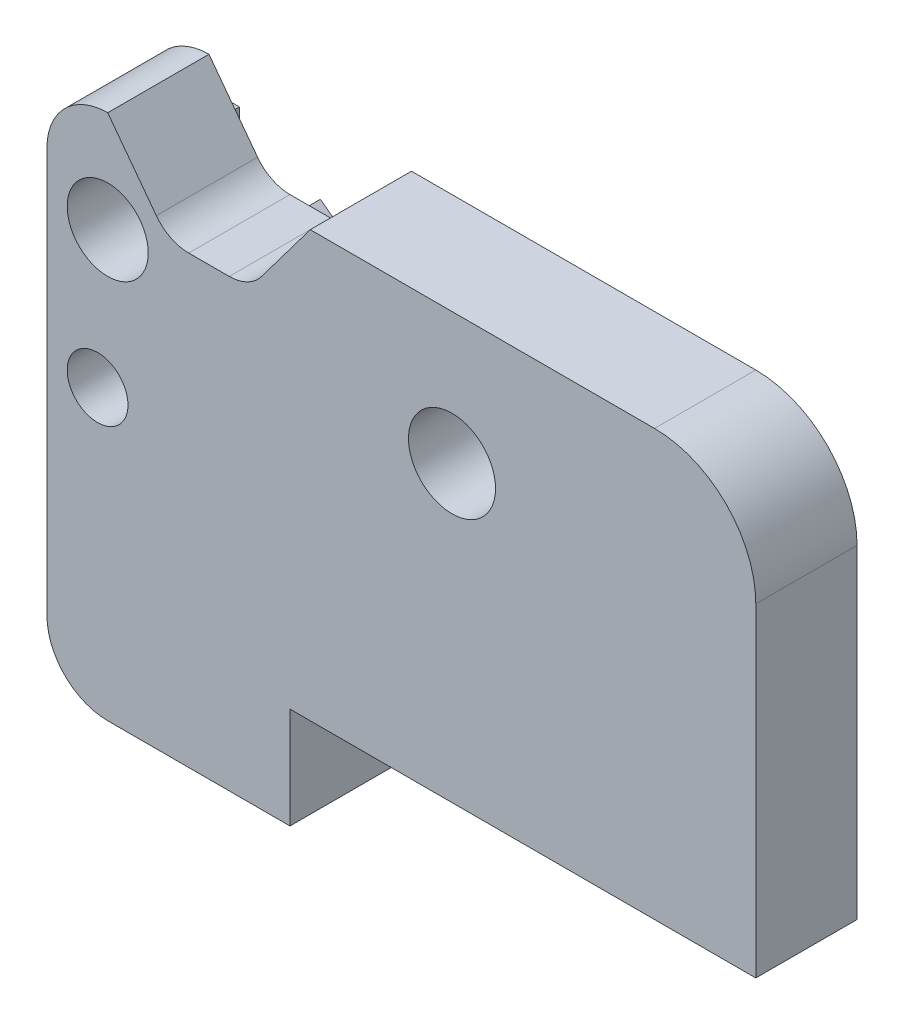
ISO-10303-21;
HEADER;
FILE_DESCRIPTION(('STEP AP214'),'2;1');
FILE_NAME('part.step','',(''),(''),'','','');
FILE_SCHEMA(('AUTOMOTIVE_DESIGN { 1 0 10303 214 1 1 1 1 }'));
ENDSEC;
DATA;
#1=APPLICATION_CONTEXT('core data for automotive mechanical design processes');
#2=APPLICATION_PROTOCOL_DEFINITION('international standard','automotive_design',2000,#1);
#3=PRODUCT_CONTEXT('',#1,'mechanical');
#4=PRODUCT('Part','Part','',(#3));
#5=PRODUCT_RELATED_PRODUCT_CATEGORY('part','',(#4));
#6=PRODUCT_DEFINITION_FORMATION('','',#4);
#7=PRODUCT_DEFINITION_CONTEXT('part definition',#1,'design');
#8=PRODUCT_DEFINITION('design','',#6,#7);
#9=PRODUCT_DEFINITION_SHAPE('','',#8);
#10=(LENGTH_UNIT() NAMED_UNIT(*) SI_UNIT(.MILLI.,.METRE.));
#11=(NAMED_UNIT(*) PLANE_ANGLE_UNIT() SI_UNIT($,.RADIAN.));
#12=(NAMED_UNIT(*) SI_UNIT($,.STERADIAN.) SOLID_ANGLE_UNIT());
#13=UNCERTAINTY_MEASURE_WITH_UNIT(LENGTH_MEASURE(1.E-05),#10,'distance_accuracy_value','');
#14=(GEOMETRIC_REPRESENTATION_CONTEXT(3) GLOBAL_UNCERTAINTY_ASSIGNED_CONTEXT((#13)) GLOBAL_UNIT_ASSIGNED_CONTEXT((#10,
#11,#12)) REPRESENTATION_CONTEXT('',''));
#15=CARTESIAN_POINT('',(0.,0.,0.));
#16=DIRECTION('',(0.,0.,1.));
#17=DIRECTION('',(1.,0.,0.));
#18=AXIS2_PLACEMENT_3D('',#15,#16,#17);
#19=CARTESIAN_POINT('',(-8.,6.5,0.));
#20=DIRECTION('',(0.,0.,1.));
#21=DIRECTION('',(1.,0.,0.));
#22=AXIS2_PLACEMENT_3D('',#19,#20,#21);
#23=PLANE('',#22);
#24=CARTESIAN_POINT('',(-17.,3.5,0.));
#25=DIRECTION('',(0.,0.,1.));
#26=DIRECTION('',(1.,0.,0.));
#27=AXIS2_PLACEMENT_3D('',#24,#25,#26);
#28=CIRCLE('',#27,3.);
#29=CARTESIAN_POINT('',(-20.,3.5,0.));
#30=VERTEX_POINT('',#29);
#31=CARTESIAN_POINT('',(-17.,6.5,0.));
#32=VERTEX_POINT('',#31);
#33=EDGE_CURVE('E397',#30,#32,#28,.F.);
#34=ORIENTED_EDGE('',*,*,#33,.T.);
#35=DIRECTION('',(-0.6,0.8,0.));
#36=VECTOR('',#35,1.);
#37=CARTESIAN_POINT('',(-14.,2.5,0.));
#38=LINE('',#37,#36);
#39=CARTESIAN_POINT('',(-14.6,3.3,0.));
#40=VERTEX_POINT('',#39);
#41=EDGE_CURVE('E211',#40,#32,#38,.T.);
#42=ORIENTED_EDGE('',*,*,#41,.F.);
#43=CARTESIAN_POINT('',(-13.,4.5,0.));
#44=DIRECTION('',(0.,0.,1.));
#45=DIRECTION('',(1.,0.,0.));
#46=AXIS2_PLACEMENT_3D('',#43,#44,#45);
#47=CIRCLE('',#46,2.);
#48=CARTESIAN_POINT('',(-13.,2.5,0.));
#49=VERTEX_POINT('',#48);
#50=EDGE_CURVE('E11',#40,#49,#47,.T.);
#51=ORIENTED_EDGE('',*,*,#50,.T.);
#52=DIRECTION('',(-1.,0.,0.));
#53=VECTOR('',#52,1.);
#54=CARTESIAN_POINT('',(-14.,2.5,0.));
#55=LINE('',#54,#53);
#56=CARTESIAN_POINT('',(-11.,2.5,0.));
#57=VERTEX_POINT('',#56);
#58=EDGE_CURVE('E747',#57,#49,#55,.T.);
#59=ORIENTED_EDGE('',*,*,#58,.F.);
#60=CARTESIAN_POINT('',(-11.,4.5,0.));
#61=DIRECTION('',(0.,0.,1.));
#62=DIRECTION('',(1.,0.,0.));
#63=AXIS2_PLACEMENT_3D('',#60,#61,#62);
#64=CIRCLE('',#63,2.);
#65=CARTESIAN_POINT('',(-9.40000000000001,3.3,0.));
#66=VERTEX_POINT('',#65);
#67=EDGE_CURVE('E355',#57,#66,#64,.T.);
#68=ORIENTED_EDGE('',*,*,#67,.T.);
#69=DIRECTION('',(-0.600000000000001,-0.799999999999999,0.));
#70=VECTOR('',#69,1.);
#71=CARTESIAN_POINT('',(-10.,2.5,0.));
#72=LINE('',#71,#70);
#73=CARTESIAN_POINT('',(-7.,6.5,0.));
#74=VERTEX_POINT('',#73);
#75=EDGE_CURVE('E373',#74,#66,#72,.T.);
#76=ORIENTED_EDGE('',*,*,#75,.F.);
#77=DIRECTION('',(-1.,0.,0.));
#78=VECTOR('',#77,1.);
#79=CARTESIAN_POINT('',(15.,6.5,0.));
#80=LINE('',#79,#78);
#81=CARTESIAN_POINT('',(10.,6.5,0.));
#82=VERTEX_POINT('',#81);
#83=EDGE_CURVE('E210',#82,#74,#80,.T.);
#84=ORIENTED_EDGE('',*,*,#83,.F.);
#85=CARTESIAN_POINT('',(10.,1.5,0.));
#86=DIRECTION('',(0.,0.,1.));
#87=DIRECTION('',(1.,0.,0.));
#88=AXIS2_PLACEMENT_3D('',#85,#86,#87);
#89=CIRCLE('',#88,5.);
#90=CARTESIAN_POINT('',(15.,1.49999999999999,0.));
#91=VERTEX_POINT('',#90);
#92=EDGE_CURVE('E746',#82,#91,#89,.F.);
#93=ORIENTED_EDGE('',*,*,#92,.T.);
#94=DIRECTION('',(0.,1.,0.));
#95=VECTOR('',#94,1.);
#96=CARTESIAN_POINT('',(15.,-14.5,0.));
#97=LINE('',#96,#95);
#98=CARTESIAN_POINT('',(15.,-14.5,0.));
#99=VERTEX_POINT('',#98);
#100=EDGE_CURVE('E219',#99,#91,#97,.T.);
#101=ORIENTED_EDGE('',*,*,#100,.F.);
#102=DIRECTION('',(1.,0.,0.));
#103=VECTOR('',#102,1.);
#104=CARTESIAN_POINT('',(-8.,-14.5,0.));
#105=LINE('',#104,#103);
#106=CARTESIAN_POINT('',(-2.00000000000001,-14.5,0.));
#107=VERTEX_POINT('',#106);
#108=EDGE_CURVE('E224',#107,#99,#105,.T.);
#109=ORIENTED_EDGE('',*,*,#108,.F.);
#110=DIRECTION('',(0.,-1.,0.));
#111=VECTOR('',#110,1.);
#112=CARTESIAN_POINT('',(-2.,-11.07,0.));
#113=LINE('',#112,#111);
#114=CARTESIAN_POINT('',(-2.,-11.07,0.));
#115=VERTEX_POINT('',#114);
#116=EDGE_CURVE('E411',#115,#107,#113,.T.);
#117=ORIENTED_EDGE('',*,*,#116,.F.);
#118=DIRECTION('',(0.800119256629199,-0.599840958230711,0.));
#119=VECTOR('',#118,1.);
#120=CARTESIAN_POINT('',(-18.1,1.,0.));
#121=LINE('',#120,#119);
#122=CARTESIAN_POINT('',(-15.5,-0.949192546583849,0.));
#123=VERTEX_POINT('',#122);
#124=EDGE_CURVE('E416',#123,#115,#121,.T.);
#125=ORIENTED_EDGE('',*,*,#124,.F.);
#126=DIRECTION('',(0.,-1.,0.));
#127=VECTOR('',#126,1.);
#128=CARTESIAN_POINT('',(-15.5,-7.49999999999999,0.));
#129=LINE('',#128,#127);
#130=CARTESIAN_POINT('',(-15.5,-5.49999999999999,0.));
#131=VERTEX_POINT('',#130);
#132=EDGE_CURVE('E718',#123,#131,#129,.T.);
#133=ORIENTED_EDGE('',*,*,#132,.T.);
#134=CARTESIAN_POINT('',(-17.5,-5.49999999999999,0.));
#135=DIRECTION('',(0.,0.,1.));
#136=DIRECTION('',(1.,0.,0.));
#137=AXIS2_PLACEMENT_3D('',#134,#135,#136);
#138=CIRCLE('',#137,2.);
#139=CARTESIAN_POINT('',(-17.5,-7.49999999999999,0.));
#140=VERTEX_POINT('',#139);
#141=EDGE_CURVE('E381',#131,#140,#138,.F.);
#142=ORIENTED_EDGE('',*,*,#141,.T.);
#143=CARTESIAN_POINT('',(-17.5,-5.49999999999999,0.));
#144=DIRECTION('',(0.,0.,1.));
#145=DIRECTION('',(1.,0.,0.));
#146=AXIS2_PLACEMENT_3D('',#143,#144,#145);
#147=CIRCLE('',#146,2.);
#148=CARTESIAN_POINT('',(-19.5,-5.49999999999999,0.));
#149=VERTEX_POINT('',#148);
#150=EDGE_CURVE('E379',#140,#149,#147,.F.);
#151=ORIENTED_EDGE('',*,*,#150,.T.);
#152=DIRECTION('',(0.,1.,0.));
#153=VECTOR('',#152,1.);
#154=CARTESIAN_POINT('',(-19.5,1.00000000000001,0.));
#155=LINE('',#154,#153);
#156=CARTESIAN_POINT('',(-19.5,1.00000000000001,0.));
#157=VERTEX_POINT('',#156);
#158=EDGE_CURVE('E674',#149,#157,#155,.T.);
#159=ORIENTED_EDGE('',*,*,#158,.T.);
#160=DIRECTION('',(1.,0.,0.));
#161=VECTOR('',#160,1.);
#162=CARTESIAN_POINT('',(-20.,1.,0.));
#163=LINE('',#162,#161);
#164=CARTESIAN_POINT('',(-20.,1.00000000000001,0.));
#165=VERTEX_POINT('',#164);
#166=EDGE_CURVE('E256',#165,#157,#163,.T.);
#167=ORIENTED_EDGE('',*,*,#166,.F.);
#168=DIRECTION('',(0.,1.,0.));
#169=VECTOR('',#168,1.);
#170=CARTESIAN_POINT('',(-20.,6.5,0.));
#171=LINE('',#170,#169);
#172=EDGE_CURVE('E250',#165,#30,#171,.T.);
#173=ORIENTED_EDGE('',*,*,#172,.T.);
#174=EDGE_LOOP('',(#34,#42,#51,#59,#68,#76,#84,#93,#101,#109,#117,#125,#133,#142,#151,#159,#167,#173));
#175=FACE_BOUND('',#174,.T.);
#176=CARTESIAN_POINT('',(4.9,-6.5,0.));
#177=DIRECTION('',(0.,0.,-1.));
#178=DIRECTION('',(-1.,0.,0.));
#179=AXIS2_PLACEMENT_3D('',#176,#177,#178);
#180=CIRCLE('',#179,4.5);
#181=CARTESIAN_POINT('',(0.4,-6.5,0.));
#182=VERTEX_POINT('',#181);
#183=EDGE_CURVE('E277',#182,#182,#180,.T.);
#184=ORIENTED_EDGE('',*,*,#183,.F.);
#185=EDGE_LOOP('',(#184));
#186=FACE_BOUND('',#185,.T.);
#187=CARTESIAN_POINT('',(-17.5,-5.5,0.));
#188=DIRECTION('',(0.,0.,1.));
#189=DIRECTION('',(1.,0.,0.));
#190=AXIS2_PLACEMENT_3D('',#187,#188,#189);
#191=CIRCLE('',#190,1.5);
#192=CARTESIAN_POINT('',(-16.,-5.5,0.));
#193=VERTEX_POINT('',#192);
#194=EDGE_CURVE('E667',#193,#193,#191,.F.);
#195=ORIENTED_EDGE('',*,*,#194,.F.);
#196=EDGE_LOOP('',(#195));
#197=FACE_BOUND('',#196,.T.);
#198=ADVANCED_FACE('F36',(#175,#186,#197),#23,.F.);
#199=CARTESIAN_POINT('',(15.,6.5,5.));
#200=DIRECTION('',(0.,-1.,0.));
#201=DIRECTION('',(1.,0.,0.));
#202=AXIS2_PLACEMENT_3D('',#199,#200,#201);
#203=PLANE('',#202);
#204=ORIENTED_EDGE('',*,*,#83,.T.);
#205=DIRECTION('',(0.,0.,1.));
#206=VECTOR('',#205,1.);
#207=CARTESIAN_POINT('',(-7.,6.5,-10.770329614269));
#208=LINE('',#207,#206);
#209=CARTESIAN_POINT('',(-7.,6.5,5.));
#210=VERTEX_POINT('',#209);
#211=EDGE_CURVE('E194',#74,#210,#208,.T.);
#212=ORIENTED_EDGE('',*,*,#211,.T.);
#213=DIRECTION('',(-1.,0.,0.));
#214=VECTOR('',#213,1.);
#215=CARTESIAN_POINT('',(15.,6.5,5.));
#216=LINE('',#215,#214);
#217=CARTESIAN_POINT('',(10.,6.5,5.));
#218=VERTEX_POINT('',#217);
#219=EDGE_CURVE('E207',#218,#210,#216,.T.);
#220=ORIENTED_EDGE('',*,*,#219,.F.);
#221=DIRECTION('',(0.,0.,-1.));
#222=VECTOR('',#221,1.);
#223=CARTESIAN_POINT('',(10.,6.5,5.));
#224=LINE('',#223,#222);
#225=EDGE_CURVE('E239',#218,#82,#224,.T.);
#226=ORIENTED_EDGE('',*,*,#225,.T.);
#227=EDGE_LOOP('',(#204,#212,#220,#226));
#228=FACE_BOUND('',#227,.T.);
#229=ADVANCED_FACE('F205',(#228),#203,.F.);
#230=CARTESIAN_POINT('',(-8.,-14.5,5.));
#231=DIRECTION('',(0.,1.,0.));
#232=DIRECTION('',(0.,0.,1.));
#233=AXIS2_PLACEMENT_3D('',#230,#231,#232);
#234=PLANE('',#233);
#235=CARTESIAN_POINT('',(12.,-14.5,2.5));
#236=DIRECTION('',(0.,-1.,0.));
#237=DIRECTION('',(0.,0.,-1.));
#238=AXIS2_PLACEMENT_3D('',#235,#236,#237);
#239=CIRCLE('',#238,1.25);
#240=CARTESIAN_POINT('',(12.,-14.5,1.25));
#241=VERTEX_POINT('',#240);
#242=EDGE_CURVE('E276',#241,#241,#239,.T.);
#243=ORIENTED_EDGE('',*,*,#242,.F.);
#244=EDGE_LOOP('',(#243));
#245=FACE_BOUND('',#244,.T.);
#246=CARTESIAN_POINT('',(-1.4,-14.5,2.5));
#247=DIRECTION('',(0.,-1.,0.));
#248=DIRECTION('',(0.,0.,-1.));
#249=AXIS2_PLACEMENT_3D('',#246,#247,#248);
#250=CIRCLE('',#249,1.25);
#251=CARTESIAN_POINT('',(-1.4,-14.5,1.25));
#252=VERTEX_POINT('',#251);
#253=EDGE_CURVE('E282',#252,#252,#250,.T.);
#254=ORIENTED_EDGE('',*,*,#253,.F.);
#255=EDGE_LOOP('',(#254));
#256=FACE_BOUND('',#255,.T.);
#257=DIRECTION('',(0.,0.,-1.));
#258=VECTOR('',#257,1.);
#259=CARTESIAN_POINT('',(-8.,-14.5,5.));
#260=LINE('',#259,#258);
#261=CARTESIAN_POINT('',(-8.,-14.5,5.));
#262=VERTEX_POINT('',#261);
#263=CARTESIAN_POINT('',(-8.,-14.5,-4.));
#264=VERTEX_POINT('',#263);
#265=EDGE_CURVE('E236',#262,#264,#260,.T.);
#266=ORIENTED_EDGE('',*,*,#265,.T.);
#267=DIRECTION('',(-1.,0.,0.));
#268=VECTOR('',#267,1.);
#269=CARTESIAN_POINT('',(-2.00000000000001,-14.5,-4.));
#270=LINE('',#269,#268);
#271=CARTESIAN_POINT('',(-2.00000000000001,-14.5,-4.));
#272=VERTEX_POINT('',#271);
#273=EDGE_CURVE('E687',#272,#264,#270,.T.);
#274=ORIENTED_EDGE('',*,*,#273,.F.);
#275=DIRECTION('',(0.,0.,1.));
#276=VECTOR('',#275,1.);
#277=CARTESIAN_POINT('',(-2.00000000000001,-14.5,-4.));
#278=LINE('',#277,#276);
#279=EDGE_CURVE('E406',#272,#107,#278,.T.);
#280=ORIENTED_EDGE('',*,*,#279,.T.);
#281=ORIENTED_EDGE('',*,*,#108,.T.);
#282=DIRECTION('',(0.,0.,-1.));
#283=VECTOR('',#282,1.);
#284=CARTESIAN_POINT('',(15.,-14.5,5.));
#285=LINE('',#284,#283);
#286=CARTESIAN_POINT('',(15.,-14.5,5.));
#287=VERTEX_POINT('',#286);
#288=EDGE_CURVE('E231',#287,#99,#285,.T.);
#289=ORIENTED_EDGE('',*,*,#288,.F.);
#290=DIRECTION('',(1.,0.,0.));
#291=VECTOR('',#290,1.);
#292=CARTESIAN_POINT('',(-8.,-14.5,5.));
#293=LINE('',#292,#291);
#294=EDGE_CURVE('E218',#262,#287,#293,.T.);
#295=ORIENTED_EDGE('',*,*,#294,.F.);
#296=EDGE_LOOP('',(#266,#274,#280,#281,#289,#295));
#297=FACE_BOUND('',#296,.T.);
#298=ADVANCED_FACE('F302',(#245,#256,#297),#234,.F.);
#299=CARTESIAN_POINT('',(15.,-14.5,5.));
#300=DIRECTION('',(-1.,0.,0.));
#301=DIRECTION('',(0.,0.,1.));
#302=AXIS2_PLACEMENT_3D('',#299,#300,#301);
#303=PLANE('',#302);
#304=ORIENTED_EDGE('',*,*,#100,.T.);
#305=DIRECTION('',(0.,0.,-1.));
#306=VECTOR('',#305,1.);
#307=CARTESIAN_POINT('',(15.,1.5,5.));
#308=LINE('',#307,#306);
#309=CARTESIAN_POINT('',(15.,1.49999999999999,5.));
#310=VERTEX_POINT('',#309);
#311=EDGE_CURVE('E745',#91,#310,#308,.F.);
#312=ORIENTED_EDGE('',*,*,#311,.T.);
#313=DIRECTION('',(0.,1.,0.));
#314=VECTOR('',#313,1.);
#315=CARTESIAN_POINT('',(15.,-14.5,5.));
#316=LINE('',#315,#314);
#317=EDGE_CURVE('E221',#287,#310,#316,.T.);
#318=ORIENTED_EDGE('',*,*,#317,.F.);
#319=ORIENTED_EDGE('',*,*,#288,.T.);
#320=EDGE_LOOP('',(#304,#312,#318,#319));
#321=FACE_BOUND('',#320,.T.);
#322=ADVANCED_FACE('F293',(#321),#303,.F.);
#323=CARTESIAN_POINT('',(-8.,6.5,5.));
#324=DIRECTION('',(0.,0.,1.));
#325=DIRECTION('',(1.,0.,0.));
#326=AXIS2_PLACEMENT_3D('',#323,#324,#325);
#327=PLANE('',#326);
#328=DIRECTION('',(0.6,-0.8,0.));
#329=VECTOR('',#328,1.);
#330=CARTESIAN_POINT('',(-14.,2.5,5.));
#331=LINE('',#330,#329);
#332=CARTESIAN_POINT('',(-17.,6.5,5.));
#333=VERTEX_POINT('',#332);
#334=CARTESIAN_POINT('',(-14.6,3.3,5.));
#335=VERTEX_POINT('',#334);
#336=EDGE_CURVE('E199',#333,#335,#331,.T.);
#337=ORIENTED_EDGE('',*,*,#336,.F.);
#338=CARTESIAN_POINT('',(-17.,3.5,5.));
#339=DIRECTION('',(0.,0.,1.));
#340=DIRECTION('',(1.,0.,0.));
#341=AXIS2_PLACEMENT_3D('',#338,#339,#340);
#342=CIRCLE('',#341,3.);
#343=CARTESIAN_POINT('',(-20.,3.5,5.));
#344=VERTEX_POINT('',#343);
#345=EDGE_CURVE('E391',#333,#344,#342,.T.);
#346=ORIENTED_EDGE('',*,*,#345,.T.);
#347=DIRECTION('',(0.,1.,0.));
#348=VECTOR('',#347,1.);
#349=CARTESIAN_POINT('',(-20.,6.5,5.));
#350=LINE('',#349,#348);
#351=CARTESIAN_POINT('',(-20.,-16.5,5.));
#352=VERTEX_POINT('',#351);
#353=EDGE_CURVE('E265',#352,#344,#350,.T.);
#354=ORIENTED_EDGE('',*,*,#353,.F.);
#355=CARTESIAN_POINT('',(-17.,-16.5,5.));
#356=DIRECTION('',(0.,0.,1.));
#357=DIRECTION('',(1.,0.,0.));
#358=AXIS2_PLACEMENT_3D('',#355,#356,#357);
#359=CIRCLE('',#358,3.);
#360=CARTESIAN_POINT('',(-17.,-19.5,5.));
#361=VERTEX_POINT('',#360);
#362=EDGE_CURVE('E393',#352,#361,#359,.T.);
#363=ORIENTED_EDGE('',*,*,#362,.T.);
#364=DIRECTION('',(-1.,0.,0.));
#365=VECTOR('',#364,1.);
#366=CARTESIAN_POINT('',(-8.,-19.5,5.));
#367=LINE('',#366,#365);
#368=CARTESIAN_POINT('',(-8.,-19.5,5.));
#369=VERTEX_POINT('',#368);
#370=EDGE_CURVE('E254',#369,#361,#367,.T.);
#371=ORIENTED_EDGE('',*,*,#370,.F.);
#372=DIRECTION('',(0.,-1.,0.));
#373=VECTOR('',#372,1.);
#374=CARTESIAN_POINT('',(-8.,6.5,5.));
#375=LINE('',#374,#373);
#376=EDGE_CURVE('E270',#262,#369,#375,.T.);
#377=ORIENTED_EDGE('',*,*,#376,.F.);
#378=ORIENTED_EDGE('',*,*,#294,.T.);
#379=ORIENTED_EDGE('',*,*,#317,.T.);
#380=CARTESIAN_POINT('',(10.,1.5,5.));
#381=DIRECTION('',(0.,0.,1.));
#382=DIRECTION('',(1.,0.,0.));
#383=AXIS2_PLACEMENT_3D('',#380,#381,#382);
#384=CIRCLE('',#383,5.);
#385=EDGE_CURVE('E217',#310,#218,#384,.T.);
#386=ORIENTED_EDGE('',*,*,#385,.T.);
#387=ORIENTED_EDGE('',*,*,#219,.T.);
#388=DIRECTION('',(0.600000000000001,0.799999999999999,0.));
#389=VECTOR('',#388,1.);
#390=CARTESIAN_POINT('',(-10.,2.5,5.));
#391=LINE('',#390,#389);
#392=CARTESIAN_POINT('',(-9.40000000000001,3.3,5.));
#393=VERTEX_POINT('',#392);
#394=EDGE_CURVE('E190',#393,#210,#391,.T.);
#395=ORIENTED_EDGE('',*,*,#394,.F.);
#396=CARTESIAN_POINT('',(-11.,4.5,5.));
#397=DIRECTION('',(0.,0.,1.));
#398=DIRECTION('',(1.,0.,0.));
#399=AXIS2_PLACEMENT_3D('',#396,#397,#398);
#400=CIRCLE('',#399,2.);
#401=CARTESIAN_POINT('',(-11.,2.5,5.));
#402=VERTEX_POINT('',#401);
#403=EDGE_CURVE('E358',#393,#402,#400,.F.);
#404=ORIENTED_EDGE('',*,*,#403,.T.);
#405=DIRECTION('',(1.,0.,0.));
#406=VECTOR('',#405,1.);
#407=CARTESIAN_POINT('',(-14.,2.5,5.));
#408=LINE('',#407,#406);
#409=CARTESIAN_POINT('',(-13.,2.5,5.));
#410=VERTEX_POINT('',#409);
#411=EDGE_CURVE('E200',#410,#402,#408,.T.);
#412=ORIENTED_EDGE('',*,*,#411,.F.);
#413=CARTESIAN_POINT('',(-13.,4.5,5.));
#414=DIRECTION('',(0.,0.,1.));
#415=DIRECTION('',(1.,0.,0.));
#416=AXIS2_PLACEMENT_3D('',#413,#414,#415);
#417=CIRCLE('',#416,2.);
#418=EDGE_CURVE('E44',#410,#335,#417,.F.);
#419=ORIENTED_EDGE('',*,*,#418,.T.);
#420=EDGE_LOOP('',(#337,#346,#354,#363,#371,#377,#378,#379,#386,#387,#395,#404,#412,#419));
#421=FACE_BOUND('',#420,.T.);
#422=CARTESIAN_POINT('',(-17.5,-5.5,5.));
#423=DIRECTION('',(0.,0.,1.));
#424=DIRECTION('',(1.,0.,0.));
#425=AXIS2_PLACEMENT_3D('',#422,#423,#424);
#426=CIRCLE('',#425,1.5);
#427=CARTESIAN_POINT('',(-16.,-5.5,5.));
#428=VERTEX_POINT('',#427);
#429=EDGE_CURVE('E432',#428,#428,#426,.T.);
#430=ORIENTED_EDGE('',*,*,#429,.F.);
#431=EDGE_LOOP('',(#430));
#432=FACE_BOUND('',#431,.T.);
#433=CARTESIAN_POINT('',(-17.,1.5,5.));
#434=DIRECTION('',(0.,0.,1.));
#435=DIRECTION('',(1.,0.,0.));
#436=AXIS2_PLACEMENT_3D('',#433,#434,#435);
#437=CIRCLE('',#436,2.);
#438=CARTESIAN_POINT('',(-15.,1.5,5.));
#439=VERTEX_POINT('',#438);
#440=EDGE_CURVE('E261',#439,#439,#437,.T.);
#441=ORIENTED_EDGE('',*,*,#440,.F.);
#442=EDGE_LOOP('',(#441));
#443=FACE_BOUND('',#442,.T.);
#444=CARTESIAN_POINT('',(0.,0.,5.));
#445=DIRECTION('',(0.,0.,1.));
#446=DIRECTION('',(1.,0.,0.));
#447=AXIS2_PLACEMENT_3D('',#444,#445,#446);
#448=CIRCLE('',#447,2.15);
#449=CARTESIAN_POINT('',(2.15,0.,5.));
#450=VERTEX_POINT('',#449);
#451=EDGE_CURVE('E228',#450,#450,#448,.T.);
#452=ORIENTED_EDGE('',*,*,#451,.F.);
#453=EDGE_LOOP('',(#452));
#454=FACE_BOUND('',#453,.T.);
#455=ADVANCED_FACE('F213',(#421,#432,#443,#454),#327,.T.);
#456=CARTESIAN_POINT('',(0.,0.,0.5));
#457=DIRECTION('',(0.,0.,1.));
#458=DIRECTION('',(1.,0.,0.));
#459=AXIS2_PLACEMENT_3D('',#456,#457,#458);
#460=CYLINDRICAL_SURFACE('',#459,2.15);
#461=CARTESIAN_POINT('',(0.,0.,0.5));
#462=DIRECTION('',(0.,0.,1.));
#463=DIRECTION('',(1.,0.,0.));
#464=AXIS2_PLACEMENT_3D('',#461,#462,#463);
#465=CIRCLE('',#464,2.15);
#466=CARTESIAN_POINT('',(2.15,0.,0.5));
#467=VERTEX_POINT('',#466);
#468=EDGE_CURVE('E232',#467,#467,#465,.T.);
#469=ORIENTED_EDGE('',*,*,#468,.F.);
#470=EDGE_LOOP('',(#469));
#471=FACE_BOUND('',#470,.T.);
#472=ORIENTED_EDGE('',*,*,#451,.T.);
#473=EDGE_LOOP('',(#472));
#474=FACE_BOUND('',#473,.T.);
#475=ADVANCED_FACE('F290',(#471,#474),#460,.F.);
#476=CARTESIAN_POINT('',(0.,0.,0.5));
#477=DIRECTION('',(0.,0.,1.));
#478=DIRECTION('',(1.,0.,0.));
#479=AXIS2_PLACEMENT_3D('',#476,#477,#478);
#480=PLANE('',#479);
#481=ORIENTED_EDGE('',*,*,#468,.T.);
#482=EDGE_LOOP('',(#481));
#483=FACE_BOUND('',#482,.T.);
#484=ADVANCED_FACE('F299',(#483),#480,.T.);
#485=CARTESIAN_POINT('',(-1.4,-6.5,2.5));
#486=DIRECTION('',(0.,-1.,0.));
#487=DIRECTION('',(0.,0.,-1.));
#488=AXIS2_PLACEMENT_3D('',#485,#486,#487);
#489=CYLINDRICAL_SURFACE('',#488,1.25);
#490=CARTESIAN_POINT('',(-1.4,-6.5,2.5));
#491=DIRECTION('',(0.,-1.,0.));
#492=DIRECTION('',(0.,0.,-1.));
#493=AXIS2_PLACEMENT_3D('',#490,#491,#492);
#494=CIRCLE('',#493,1.25);
#495=CARTESIAN_POINT('',(-1.4,-6.5,1.25));
#496=VERTEX_POINT('',#495);
#497=EDGE_CURVE('E426',#496,#496,#494,.T.);
#498=ORIENTED_EDGE('',*,*,#497,.F.);
#499=EDGE_LOOP('',(#498));
#500=FACE_BOUND('',#499,.T.);
#501=ORIENTED_EDGE('',*,*,#253,.T.);
#502=EDGE_LOOP('',(#501));
#503=FACE_BOUND('',#502,.T.);
#504=ADVANCED_FACE('F474',(#500,#503),#489,.F.);
#505=CARTESIAN_POINT('',(12.,-6.5,2.5));
#506=DIRECTION('',(0.,-1.,0.));
#507=DIRECTION('',(0.,0.,-1.));
#508=AXIS2_PLACEMENT_3D('',#505,#506,#507);
#509=CYLINDRICAL_SURFACE('',#508,1.25);
#510=CARTESIAN_POINT('',(12.,-6.5,2.5));
#511=DIRECTION('',(0.,-1.,0.));
#512=DIRECTION('',(0.,0.,-1.));
#513=AXIS2_PLACEMENT_3D('',#510,#511,#512);
#514=CIRCLE('',#513,1.25);
#515=CARTESIAN_POINT('',(12.,-6.5,1.25));
#516=VERTEX_POINT('',#515);
#517=EDGE_CURVE('E429',#516,#516,#514,.T.);
#518=ORIENTED_EDGE('',*,*,#517,.F.);
#519=EDGE_LOOP('',(#518));
#520=FACE_BOUND('',#519,.T.);
#521=ORIENTED_EDGE('',*,*,#242,.T.);
#522=EDGE_LOOP('',(#521));
#523=FACE_BOUND('',#522,.T.);
#524=ADVANCED_FACE('F322',(#520,#523),#509,.F.);
#525=CARTESIAN_POINT('',(10.,1.5,5.));
#526=DIRECTION('',(0.,0.,-1.));
#527=DIRECTION('',(-1.,0.,0.));
#528=AXIS2_PLACEMENT_3D('',#525,#526,#527);
#529=CYLINDRICAL_SURFACE('',#528,5.);
#530=ORIENTED_EDGE('',*,*,#385,.F.);
#531=ORIENTED_EDGE('',*,*,#311,.F.);
#532=ORIENTED_EDGE('',*,*,#92,.F.);
#533=ORIENTED_EDGE('',*,*,#225,.F.);
#534=EDGE_LOOP('',(#530,#531,#532,#533));
#535=FACE_BOUND('',#534,.T.);
#536=ADVANCED_FACE('F318',(#535),#529,.T.);
#537=CARTESIAN_POINT('',(4.9,-6.5,4.5));
#538=DIRECTION('',(0.,0.,-1.));
#539=DIRECTION('',(-1.,0.,0.));
#540=AXIS2_PLACEMENT_3D('',#537,#538,#539);
#541=CYLINDRICAL_SURFACE('',#540,4.5);
#542=CARTESIAN_POINT('',(4.9,-6.5,4.5));
#543=DIRECTION('',(0.,0.,-1.));
#544=DIRECTION('',(-1.,0.,0.));
#545=AXIS2_PLACEMENT_3D('',#542,#543,#544);
#546=CIRCLE('',#545,4.5);
#547=CARTESIAN_POINT('',(0.4,-6.5,4.5));
#548=VERTEX_POINT('',#547);
#549=EDGE_CURVE('E273',#548,#548,#546,.T.);
#550=ORIENTED_EDGE('',*,*,#549,.F.);
#551=EDGE_LOOP('',(#550));
#552=FACE_BOUND('',#551,.T.);
#553=ORIENTED_EDGE('',*,*,#183,.T.);
#554=EDGE_LOOP('',(#553));
#555=FACE_BOUND('',#554,.T.);
#556=ADVANCED_FACE('F321',(#552,#555),#541,.F.);
#557=CARTESIAN_POINT('',(4.9,-6.5,4.5));
#558=DIRECTION('',(0.,0.,-1.));
#559=DIRECTION('',(-1.,0.,0.));
#560=AXIS2_PLACEMENT_3D('',#557,#558,#559);
#561=PLANE('',#560);
#562=ORIENTED_EDGE('',*,*,#549,.T.);
#563=EDGE_LOOP('',(#562));
#564=FACE_BOUND('',#563,.T.);
#565=ADVANCED_FACE('F460',(#564),#561,.T.);
#566=CARTESIAN_POINT('',(-8.,6.5,33.6356421265527));
#567=DIRECTION('',(1.,0.,0.));
#568=DIRECTION('',(0.,1.,0.));
#569=AXIS2_PLACEMENT_3D('',#566,#567,#568);
#570=PLANE('',#569);
#571=ORIENTED_EDGE('',*,*,#265,.F.);
#572=ORIENTED_EDGE('',*,*,#376,.T.);
#573=DIRECTION('',(0.,0.,-1.));
#574=VECTOR('',#573,1.);
#575=CARTESIAN_POINT('',(-8.,-19.5,33.6356421265527));
#576=LINE('',#575,#574);
#577=CARTESIAN_POINT('',(-8.,-19.5,-4.));
#578=VERTEX_POINT('',#577);
#579=EDGE_CURVE('E272',#369,#578,#576,.T.);
#580=ORIENTED_EDGE('',*,*,#579,.T.);
#581=DIRECTION('',(0.,-1.,0.));
#582=VECTOR('',#581,1.);
#583=CARTESIAN_POINT('',(-8.,-14.5,-4.));
#584=LINE('',#583,#582);
#585=EDGE_CURVE('E690',#264,#578,#584,.T.);
#586=ORIENTED_EDGE('',*,*,#585,.F.);
#587=EDGE_LOOP('',(#571,#572,#580,#586));
#588=FACE_BOUND('',#587,.T.);
#589=ADVANCED_FACE('F458',(#588),#570,.T.);
#590=CARTESIAN_POINT('',(-8.,-19.5,33.6356421265527));
#591=DIRECTION('',(0.,-1.,0.));
#592=DIRECTION('',(0.,0.,-1.));
#593=AXIS2_PLACEMENT_3D('',#590,#591,#592);
#594=PLANE('',#593);
#595=ORIENTED_EDGE('',*,*,#370,.T.);
#596=DIRECTION('',(0.,0.,-1.));
#597=VECTOR('',#596,1.);
#598=CARTESIAN_POINT('',(-17.,-19.5,33.6356421265527));
#599=LINE('',#598,#597);
#600=CARTESIAN_POINT('',(-17.,-19.5,-4.));
#601=VERTEX_POINT('',#600);
#602=EDGE_CURVE('E388',#361,#601,#599,.T.);
#603=ORIENTED_EDGE('',*,*,#602,.T.);
#604=DIRECTION('',(-1.,0.,0.));
#605=VECTOR('',#604,1.);
#606=CARTESIAN_POINT('',(-20.,-19.5,-4.));
#607=LINE('',#606,#605);
#608=EDGE_CURVE('E410',#578,#601,#607,.T.);
#609=ORIENTED_EDGE('',*,*,#608,.F.);
#610=ORIENTED_EDGE('',*,*,#579,.F.);
#611=EDGE_LOOP('',(#595,#603,#609,#610));
#612=FACE_BOUND('',#611,.T.);
#613=ADVANCED_FACE('F453',(#612),#594,.T.);
#614=CARTESIAN_POINT('',(-20.,6.5,33.6356421265527));
#615=DIRECTION('',(-1.,0.,0.));
#616=DIRECTION('',(0.,-1.,0.));
#617=AXIS2_PLACEMENT_3D('',#614,#615,#616);
#618=PLANE('',#617);
#619=ORIENTED_EDGE('',*,*,#353,.T.);
#620=DIRECTION('',(0.,0.,-1.));
#621=VECTOR('',#620,1.);
#622=CARTESIAN_POINT('',(-20.,3.5,0.));
#623=LINE('',#622,#621);
#624=EDGE_CURVE('E399',#344,#30,#623,.T.);
#625=ORIENTED_EDGE('',*,*,#624,.T.);
#626=ORIENTED_EDGE('',*,*,#172,.F.);
#627=DIRECTION('',(0.,0.,1.));
#628=VECTOR('',#627,1.);
#629=CARTESIAN_POINT('',(-20.,1.,-4.));
#630=LINE('',#629,#628);
#631=CARTESIAN_POINT('',(-20.,1.,-4.));
#632=VERTEX_POINT('',#631);
#633=EDGE_CURVE('E425',#632,#165,#630,.T.);
#634=ORIENTED_EDGE('',*,*,#633,.F.);
#635=DIRECTION('',(0.,1.,0.));
#636=VECTOR('',#635,1.);
#637=CARTESIAN_POINT('',(-20.,-19.5,-4.));
#638=LINE('',#637,#636);
#639=CARTESIAN_POINT('',(-20.,-16.5,-4.));
#640=VERTEX_POINT('',#639);
#641=EDGE_CURVE('E415',#640,#632,#638,.T.);
#642=ORIENTED_EDGE('',*,*,#641,.F.);
#643=DIRECTION('',(0.,0.,-1.));
#644=VECTOR('',#643,1.);
#645=CARTESIAN_POINT('',(-20.,-16.5,33.6356421265527));
#646=LINE('',#645,#644);
#647=EDGE_CURVE('E402',#640,#352,#646,.F.);
#648=ORIENTED_EDGE('',*,*,#647,.T.);
#649=EDGE_LOOP('',(#619,#625,#626,#634,#642,#648));
#650=FACE_BOUND('',#649,.T.);
#651=ADVANCED_FACE('F444',(#650),#618,.T.);
#652=CARTESIAN_POINT('',(-17.,1.5,1.));
#653=DIRECTION('',(0.,0.,1.));
#654=DIRECTION('',(1.,0.,0.));
#655=AXIS2_PLACEMENT_3D('',#652,#653,#654);
#656=CYLINDRICAL_SURFACE('',#655,2.);
#657=CARTESIAN_POINT('',(-17.,1.5,1.));
#658=DIRECTION('',(0.,0.,1.));
#659=DIRECTION('',(1.,0.,0.));
#660=AXIS2_PLACEMENT_3D('',#657,#658,#659);
#661=CIRCLE('',#660,2.);
#662=CARTESIAN_POINT('',(-15.,1.5,1.));
#663=VERTEX_POINT('',#662);
#664=EDGE_CURVE('E255',#663,#663,#661,.T.);
#665=ORIENTED_EDGE('',*,*,#664,.F.);
#666=EDGE_LOOP('',(#665));
#667=FACE_BOUND('',#666,.T.);
#668=ORIENTED_EDGE('',*,*,#440,.T.);
#669=EDGE_LOOP('',(#668));
#670=FACE_BOUND('',#669,.T.);
#671=ADVANCED_FACE('F440',(#667,#670),#656,.F.);
#672=CARTESIAN_POINT('',(-17.,1.5,1.));
#673=DIRECTION('',(0.,0.,1.));
#674=DIRECTION('',(1.,0.,0.));
#675=AXIS2_PLACEMENT_3D('',#672,#673,#674);
#676=PLANE('',#675);
#677=ORIENTED_EDGE('',*,*,#664,.T.);
#678=EDGE_LOOP('',(#677));
#679=FACE_BOUND('',#678,.T.);
#680=ADVANCED_FACE('F443',(#679),#676,.T.);
#681=CARTESIAN_POINT('',(-17.5,-5.5,-4.24264068711929));
#682=DIRECTION('',(0.,0.,1.));
#683=DIRECTION('',(1.,0.,0.));
#684=AXIS2_PLACEMENT_3D('',#681,#682,#683);
#685=CYLINDRICAL_SURFACE('',#684,1.5);
#686=ORIENTED_EDGE('',*,*,#194,.T.);
#687=EDGE_LOOP('',(#686));
#688=FACE_BOUND('',#687,.T.);
#689=ORIENTED_EDGE('',*,*,#429,.T.);
#690=EDGE_LOOP('',(#689));
#691=FACE_BOUND('',#690,.T.);
#692=ADVANCED_FACE('F451',(#688,#691),#685,.F.);
#693=CARTESIAN_POINT('',(12.,-6.5,2.5));
#694=DIRECTION('',(0.,-1.,0.));
#695=DIRECTION('',(0.,0.,-1.));
#696=AXIS2_PLACEMENT_3D('',#693,#694,#695);
#697=CONICAL_SURFACE('',#696,1.25,1.02974425867665);
#698=CARTESIAN_POINT('',(12.,-5.74892422621555,2.5));
#699=VERTEX_POINT('',#698);
#700=VERTEX_LOOP('',#699);
#701=FACE_BOUND('',#700,.T.);
#702=ORIENTED_EDGE('',*,*,#517,.T.);
#703=EDGE_LOOP('',(#702));
#704=FACE_BOUND('',#703,.T.);
#705=ADVANCED_FACE('F656',(#701,#704),#697,.F.);
#706=CARTESIAN_POINT('',(-1.4,-6.5,2.5));
#707=DIRECTION('',(0.,-1.,0.));
#708=DIRECTION('',(0.,0.,-1.));
#709=AXIS2_PLACEMENT_3D('',#706,#707,#708);
#710=CONICAL_SURFACE('',#709,1.25,1.02974425867665);
#711=CARTESIAN_POINT('',(-1.4,-5.74892422621555,2.5));
#712=VERTEX_POINT('',#711);
#713=VERTEX_LOOP('',#712);
#714=FACE_BOUND('',#713,.T.);
#715=ORIENTED_EDGE('',*,*,#497,.T.);
#716=EDGE_LOOP('',(#715));
#717=FACE_BOUND('',#716,.T.);
#718=ADVANCED_FACE('F562',(#714,#717),#710,.F.);
#719=CARTESIAN_POINT('',(-20.,1.,-4.));
#720=DIRECTION('',(0.,0.,-1.));
#721=DIRECTION('',(-1.,0.,0.));
#722=AXIS2_PLACEMENT_3D('',#719,#720,#721);
#723=PLANE('',#722);
#724=DIRECTION('',(0.,-1.,0.));
#725=VECTOR('',#724,1.);
#726=CARTESIAN_POINT('',(-15.5,-7.49999999999999,-4.));
#727=LINE('',#726,#725);
#728=CARTESIAN_POINT('',(-15.5,-0.949192546583849,-4.));
#729=VERTEX_POINT('',#728);
#730=CARTESIAN_POINT('',(-15.5,-5.49999999999999,-4.));
#731=VERTEX_POINT('',#730);
#732=EDGE_CURVE('E372',#729,#731,#727,.T.);
#733=ORIENTED_EDGE('',*,*,#732,.F.);
#734=DIRECTION('',(0.800119256629199,-0.599840958230711,0.));
#735=VECTOR('',#734,1.);
#736=CARTESIAN_POINT('',(-18.1,1.,-4.));
#737=LINE('',#736,#735);
#738=CARTESIAN_POINT('',(-2.,-11.07,-4.));
#739=VERTEX_POINT('',#738);
#740=EDGE_CURVE('E683',#729,#739,#737,.T.);
#741=ORIENTED_EDGE('',*,*,#740,.T.);
#742=DIRECTION('',(0.,-1.,0.));
#743=VECTOR('',#742,1.);
#744=CARTESIAN_POINT('',(-2.,-11.07,-4.));
#745=LINE('',#744,#743);
#746=EDGE_CURVE('E685',#739,#272,#745,.T.);
#747=ORIENTED_EDGE('',*,*,#746,.T.);
#748=ORIENTED_EDGE('',*,*,#273,.T.);
#749=ORIENTED_EDGE('',*,*,#585,.T.);
#750=ORIENTED_EDGE('',*,*,#608,.T.);
#751=CARTESIAN_POINT('',(-17.,-16.5,-4.));
#752=DIRECTION('',(0.,0.,-1.));
#753=DIRECTION('',(-1.,0.,0.));
#754=AXIS2_PLACEMENT_3D('',#751,#752,#753);
#755=CIRCLE('',#754,3.);
#756=EDGE_CURVE('E386',#601,#640,#755,.T.);
#757=ORIENTED_EDGE('',*,*,#756,.T.);
#758=ORIENTED_EDGE('',*,*,#641,.T.);
#759=DIRECTION('',(1.,0.,0.));
#760=VECTOR('',#759,1.);
#761=CARTESIAN_POINT('',(-20.,1.,-4.));
#762=LINE('',#761,#760);
#763=CARTESIAN_POINT('',(-19.5,1.,-4.));
#764=VERTEX_POINT('',#763);
#765=EDGE_CURVE('E680',#632,#764,#762,.T.);
#766=ORIENTED_EDGE('',*,*,#765,.T.);
#767=DIRECTION('',(0.,1.,0.));
#768=VECTOR('',#767,1.);
#769=CARTESIAN_POINT('',(-19.5,1.00000000000001,-4.));
#770=LINE('',#769,#768);
#771=CARTESIAN_POINT('',(-19.5,-5.49999999999999,-4.));
#772=VERTEX_POINT('',#771);
#773=EDGE_CURVE('E715',#772,#764,#770,.T.);
#774=ORIENTED_EDGE('',*,*,#773,.F.);
#775=CARTESIAN_POINT('',(-17.5,-5.49999999999999,-4.));
#776=DIRECTION('',(0.,0.,-1.));
#777=DIRECTION('',(-1.,0.,0.));
#778=AXIS2_PLACEMENT_3D('',#775,#776,#777);
#779=CIRCLE('',#778,2.);
#780=CARTESIAN_POINT('',(-17.5,-7.49999999999999,-4.));
#781=VERTEX_POINT('',#780);
#782=EDGE_CURVE('E375',#772,#781,#779,.F.);
#783=ORIENTED_EDGE('',*,*,#782,.T.);
#784=CARTESIAN_POINT('',(-17.5,-5.49999999999999,-4.));
#785=DIRECTION('',(0.,0.,-1.));
#786=DIRECTION('',(-1.,0.,0.));
#787=AXIS2_PLACEMENT_3D('',#784,#785,#786);
#788=CIRCLE('',#787,2.);
#789=EDGE_CURVE('E368',#781,#731,#788,.F.);
#790=ORIENTED_EDGE('',*,*,#789,.T.);
#791=EDGE_LOOP('',(#733,#741,#747,#748,#749,#750,#757,#758,#766,#774,#783,#790));
#792=FACE_BOUND('',#791,.T.);
#793=ADVANCED_FACE('F558',(#792),#723,.T.);
#794=CARTESIAN_POINT('',(-2.,-11.07,-4.));
#795=DIRECTION('',(-1.,0.,0.));
#796=DIRECTION('',(0.,-1.,0.));
#797=AXIS2_PLACEMENT_3D('',#794,#795,#796);
#798=PLANE('',#797);
#799=ORIENTED_EDGE('',*,*,#116,.T.);
#800=ORIENTED_EDGE('',*,*,#279,.F.);
#801=ORIENTED_EDGE('',*,*,#746,.F.);
#802=DIRECTION('',(0.,0.,1.));
#803=VECTOR('',#802,1.);
#804=CARTESIAN_POINT('',(-2.,-11.07,-4.));
#805=LINE('',#804,#803);
#806=EDGE_CURVE('E409',#739,#115,#805,.T.);
#807=ORIENTED_EDGE('',*,*,#806,.T.);
#808=EDGE_LOOP('',(#799,#800,#801,#807));
#809=FACE_BOUND('',#808,.T.);
#810=ADVANCED_FACE('F541',(#809),#798,.F.);
#811=CARTESIAN_POINT('',(-18.1,1.,-4.));
#812=DIRECTION('',(-0.599840958230711,-0.8001192566292,0.));
#813=DIRECTION('',(0.8001192566292,-0.599840958230711,0.));
#814=AXIS2_PLACEMENT_3D('',#811,#812,#813);
#815=PLANE('',#814);
#816=ORIENTED_EDGE('',*,*,#740,.F.);
#817=DIRECTION('',(0.,0.,-1.));
#818=VECTOR('',#817,1.);
#819=CARTESIAN_POINT('',(-15.5,-0.949192546583849,9.39414711402797));
#820=LINE('',#819,#818);
#821=EDGE_CURVE('E678',#123,#729,#820,.T.);
#822=ORIENTED_EDGE('',*,*,#821,.F.);
#823=ORIENTED_EDGE('',*,*,#124,.T.);
#824=ORIENTED_EDGE('',*,*,#806,.F.);
#825=EDGE_LOOP('',(#816,#822,#823,#824));
#826=FACE_BOUND('',#825,.T.);
#827=ADVANCED_FACE('F536',(#826),#815,.F.);
#828=CARTESIAN_POINT('',(-20.,1.,-4.));
#829=DIRECTION('',(0.,-1.,0.));
#830=DIRECTION('',(1.,0.,0.));
#831=AXIS2_PLACEMENT_3D('',#828,#829,#830);
#832=PLANE('',#831);
#833=ORIENTED_EDGE('',*,*,#166,.T.);
#834=DIRECTION('',(0.,0.,-1.));
#835=VECTOR('',#834,1.);
#836=CARTESIAN_POINT('',(-19.5,1.00000000000001,9.39414711402797));
#837=LINE('',#836,#835);
#838=EDGE_CURVE('E670',#157,#764,#837,.T.);
#839=ORIENTED_EDGE('',*,*,#838,.T.);
#840=ORIENTED_EDGE('',*,*,#765,.F.);
#841=ORIENTED_EDGE('',*,*,#633,.T.);
#842=EDGE_LOOP('',(#833,#839,#840,#841));
#843=FACE_BOUND('',#842,.T.);
#844=ADVANCED_FACE('F328',(#843),#832,.F.);
#845=CARTESIAN_POINT('',(-17.,3.5,33.6356421265527));
#846=DIRECTION('',(0.,0.,1.));
#847=DIRECTION('',(1.,0.,0.));
#848=AXIS2_PLACEMENT_3D('',#845,#846,#847);
#849=CYLINDRICAL_SURFACE('',#848,3.);
#850=ORIENTED_EDGE('',*,*,#345,.F.);
#851=DIRECTION('',(0.,0.,-1.));
#852=VECTOR('',#851,1.);
#853=CARTESIAN_POINT('',(-17.,6.5,5.));
#854=LINE('',#853,#852);
#855=EDGE_CURVE('E395',#32,#333,#854,.F.);
#856=ORIENTED_EDGE('',*,*,#855,.F.);
#857=ORIENTED_EDGE('',*,*,#33,.F.);
#858=ORIENTED_EDGE('',*,*,#624,.F.);
#859=EDGE_LOOP('',(#850,#856,#857,#858));
#860=FACE_BOUND('',#859,.T.);
#861=ADVANCED_FACE('F324',(#860),#849,.T.);
#862=CARTESIAN_POINT('',(-17.,-16.5,33.6356421265527));
#863=DIRECTION('',(0.,0.,-1.));
#864=DIRECTION('',(-1.,0.,0.));
#865=AXIS2_PLACEMENT_3D('',#862,#863,#864);
#866=CYLINDRICAL_SURFACE('',#865,3.);
#867=ORIENTED_EDGE('',*,*,#362,.F.);
#868=ORIENTED_EDGE('',*,*,#647,.F.);
#869=ORIENTED_EDGE('',*,*,#756,.F.);
#870=ORIENTED_EDGE('',*,*,#602,.F.);
#871=EDGE_LOOP('',(#867,#868,#869,#870));
#872=FACE_BOUND('',#871,.T.);
#873=ADVANCED_FACE('F327',(#872),#866,.T.);
#874=CARTESIAN_POINT('',(-15.5,-7.49999999999999,9.39414711402797));
#875=DIRECTION('',(1.,0.,0.));
#876=DIRECTION('',(0.,0.,-1.));
#877=AXIS2_PLACEMENT_3D('',#874,#875,#876);
#878=PLANE('',#877);
#879=ORIENTED_EDGE('',*,*,#732,.T.);
#880=DIRECTION('',(0.,0.,-1.));
#881=VECTOR('',#880,1.);
#882=CARTESIAN_POINT('',(-15.5,-5.49999999999999,0.));
#883=LINE('',#882,#881);
#884=EDGE_CURVE('E377',#731,#131,#883,.F.);
#885=ORIENTED_EDGE('',*,*,#884,.T.);
#886=ORIENTED_EDGE('',*,*,#132,.F.);
#887=ORIENTED_EDGE('',*,*,#821,.T.);
#888=EDGE_LOOP('',(#879,#885,#886,#887));
#889=FACE_BOUND('',#888,.T.);
#890=ADVANCED_FACE('F332',(#889),#878,.F.);
#891=CARTESIAN_POINT('',(-19.5,1.00000000000001,9.39414711402797));
#892=DIRECTION('',(-1.,0.,0.));
#893=DIRECTION('',(0.,-1.,0.));
#894=AXIS2_PLACEMENT_3D('',#891,#892,#893);
#895=PLANE('',#894);
#896=ORIENTED_EDGE('',*,*,#158,.F.);
#897=DIRECTION('',(0.,0.,-1.));
#898=VECTOR('',#897,1.);
#899=CARTESIAN_POINT('',(-19.5,-5.49999999999999,-4.));
#900=LINE('',#899,#898);
#901=EDGE_CURVE('E383',#149,#772,#900,.T.);
#902=ORIENTED_EDGE('',*,*,#901,.T.);
#903=ORIENTED_EDGE('',*,*,#773,.T.);
#904=ORIENTED_EDGE('',*,*,#838,.F.);
#905=EDGE_LOOP('',(#896,#902,#903,#904));
#906=FACE_BOUND('',#905,.T.);
#907=ADVANCED_FACE('F341',(#906),#895,.F.);
#908=CARTESIAN_POINT('',(-17.5,-5.49999999999999,9.39414711402797));
#909=DIRECTION('',(0.,0.,1.));
#910=DIRECTION('',(1.,0.,0.));
#911=AXIS2_PLACEMENT_3D('',#908,#909,#910);
#912=CYLINDRICAL_SURFACE('',#911,2.);
#913=DIRECTION('',(0.,0.,-1.));
#914=VECTOR('',#913,1.);
#915=CARTESIAN_POINT('',(-17.5,-7.49999999999999,-4.));
#916=LINE('',#915,#914);
#917=EDGE_CURVE('E369',#140,#781,#916,.T.);
#918=ORIENTED_EDGE('',*,*,#917,.F.);
#919=ORIENTED_EDGE('',*,*,#141,.F.);
#920=ORIENTED_EDGE('',*,*,#884,.F.);
#921=ORIENTED_EDGE('',*,*,#789,.F.);
#922=EDGE_LOOP('',(#918,#919,#920,#921));
#923=FACE_BOUND('',#922,.T.);
#924=ADVANCED_FACE('F338',(#923),#912,.F.);
#925=CARTESIAN_POINT('',(-17.5,-5.49999999999999,9.39414711402797));
#926=DIRECTION('',(0.,0.,1.));
#927=DIRECTION('',(1.,0.,0.));
#928=AXIS2_PLACEMENT_3D('',#925,#926,#927);
#929=CYLINDRICAL_SURFACE('',#928,2.);
#930=ORIENTED_EDGE('',*,*,#150,.F.);
#931=ORIENTED_EDGE('',*,*,#917,.T.);
#932=ORIENTED_EDGE('',*,*,#782,.F.);
#933=ORIENTED_EDGE('',*,*,#901,.F.);
#934=EDGE_LOOP('',(#930,#931,#932,#933));
#935=FACE_BOUND('',#934,.T.);
#936=ADVANCED_FACE('F334',(#935),#929,.F.);
#937=CARTESIAN_POINT('',(-14.,2.5,-10.770329614269));
#938=DIRECTION('',(0.,-1.,0.));
#939=DIRECTION('',(0.,0.,-1.));
#940=AXIS2_PLACEMENT_3D('',#937,#938,#939);
#941=PLANE('',#940);
#942=ORIENTED_EDGE('',*,*,#411,.T.);
#943=DIRECTION('',(0.,0.,1.));
#944=VECTOR('',#943,1.);
#945=CARTESIAN_POINT('',(-11.,2.5,0.));
#946=LINE('',#945,#944);
#947=EDGE_CURVE('E356',#402,#57,#946,.F.);
#948=ORIENTED_EDGE('',*,*,#947,.T.);
#949=ORIENTED_EDGE('',*,*,#58,.T.);
#950=DIRECTION('',(0.,0.,1.));
#951=VECTOR('',#950,1.);
#952=CARTESIAN_POINT('',(-13.,2.5,5.));
#953=LINE('',#952,#951);
#954=EDGE_CURVE('E364',#49,#410,#953,.T.);
#955=ORIENTED_EDGE('',*,*,#954,.T.);
#956=EDGE_LOOP('',(#942,#948,#949,#955));
#957=FACE_BOUND('',#956,.T.);
#958=ADVANCED_FACE('F337',(#957),#941,.F.);
#959=CARTESIAN_POINT('',(-14.,2.5,-10.770329614269));
#960=DIRECTION('',(-0.8,-0.6,0.));
#961=DIRECTION('',(0.6,-0.8,0.));
#962=AXIS2_PLACEMENT_3D('',#959,#960,#961);
#963=PLANE('',#962);
#964=ORIENTED_EDGE('',*,*,#336,.T.);
#965=DIRECTION('',(0.,0.,1.));
#966=VECTOR('',#965,1.);
#967=CARTESIAN_POINT('',(-14.6,3.3,0.));
#968=LINE('',#967,#966);
#969=EDGE_CURVE('E57',#335,#40,#968,.F.);
#970=ORIENTED_EDGE('',*,*,#969,.T.);
#971=ORIENTED_EDGE('',*,*,#41,.T.);
#972=ORIENTED_EDGE('',*,*,#855,.T.);
#973=EDGE_LOOP('',(#964,#970,#971,#972));
#974=FACE_BOUND('',#973,.T.);
#975=ADVANCED_FACE('F351',(#974),#963,.F.);
#976=CARTESIAN_POINT('',(-10.,2.5,-10.770329614269));
#977=DIRECTION('',(0.799999999999999,-0.600000000000001,0.));
#978=DIRECTION('',(0.600000000000001,0.799999999999999,0.));
#979=AXIS2_PLACEMENT_3D('',#976,#977,#978);
#980=PLANE('',#979);
#981=ORIENTED_EDGE('',*,*,#75,.T.);
#982=DIRECTION('',(0.,0.,1.));
#983=VECTOR('',#982,1.);
#984=CARTESIAN_POINT('',(-9.40000000000001,3.3,5.));
#985=LINE('',#984,#983);
#986=EDGE_CURVE('E197',#66,#393,#985,.T.);
#987=ORIENTED_EDGE('',*,*,#986,.T.);
#988=ORIENTED_EDGE('',*,*,#394,.T.);
#989=ORIENTED_EDGE('',*,*,#211,.F.);
#990=EDGE_LOOP('',(#981,#987,#988,#989));
#991=FACE_BOUND('',#990,.T.);
#992=ADVANCED_FACE('F193',(#991),#980,.F.);
#993=CARTESIAN_POINT('',(-11.,4.5,-10.770329614269));
#994=DIRECTION('',(0.,0.,-1.));
#995=DIRECTION('',(-1.,0.,0.));
#996=AXIS2_PLACEMENT_3D('',#993,#994,#995);
#997=CYLINDRICAL_SURFACE('',#996,2.);
#998=ORIENTED_EDGE('',*,*,#67,.F.);
#999=ORIENTED_EDGE('',*,*,#947,.F.);
#1000=ORIENTED_EDGE('',*,*,#403,.F.);
#1001=ORIENTED_EDGE('',*,*,#986,.F.);
#1002=EDGE_LOOP('',(#998,#999,#1000,#1001));
#1003=FACE_BOUND('',#1002,.T.);
#1004=ADVANCED_FACE('F343',(#1003),#997,.F.);
#1005=CARTESIAN_POINT('',(-13.,4.5,-10.770329614269));
#1006=DIRECTION('',(0.,0.,-1.));
#1007=DIRECTION('',(-1.,0.,0.));
#1008=AXIS2_PLACEMENT_3D('',#1005,#1006,#1007);
#1009=CYLINDRICAL_SURFACE('',#1008,2.);
#1010=ORIENTED_EDGE('',*,*,#50,.F.);
#1011=ORIENTED_EDGE('',*,*,#969,.F.);
#1012=ORIENTED_EDGE('',*,*,#418,.F.);
#1013=ORIENTED_EDGE('',*,*,#954,.F.);
#1014=EDGE_LOOP('',(#1010,#1011,#1012,#1013));
#1015=FACE_BOUND('',#1014,.T.);
#1016=ADVANCED_FACE('F38',(#1015),#1009,.F.);
#1017=CLOSED_SHELL('',(#198,#229,#298,#322,#455,#475,#484,#504,#524,#536,#556,#565,#589,#613,
#651,#671,#680,#692,#705,#718,#793,#810,#827,#844,#861,#873,#890,#907,#924,#936,#958,#975,#992,
#1004,#1016));
#1018=MANIFOLD_SOLID_BREP('B2',#1017);
#1019=ADVANCED_BREP_SHAPE_REPRESENTATION('',(#18,#1018),#14);
#1020=SHAPE_DEFINITION_REPRESENTATION(#9,#1019);
ENDSEC;
END-ISO-10303-21;
